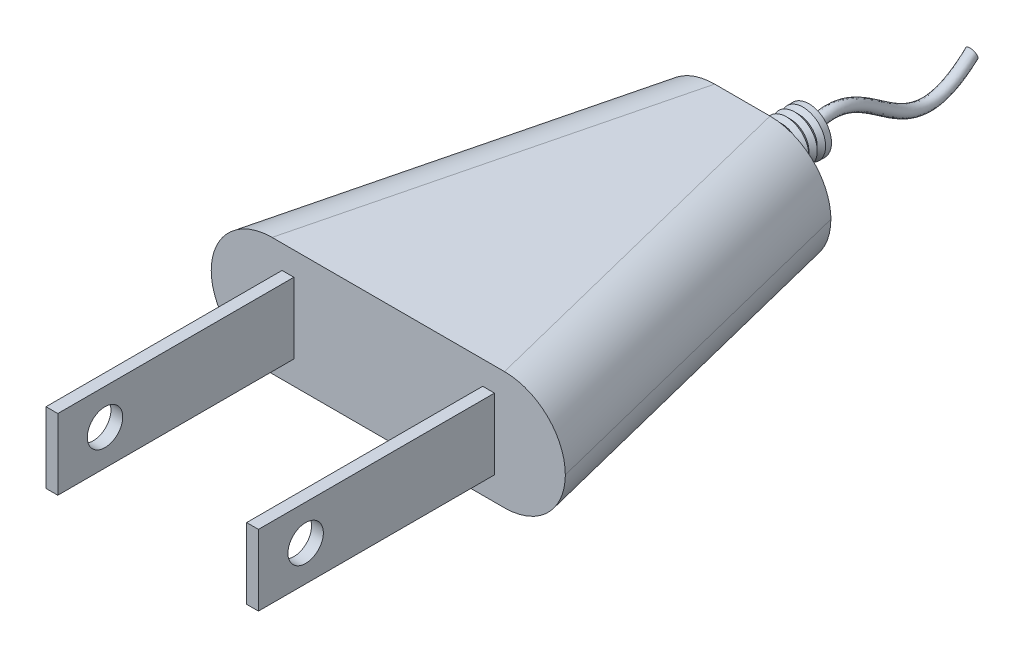
ISO-10303-21;
HEADER;
FILE_DESCRIPTION(('STEP AP214'),'2;1');
FILE_NAME('part.step','',(''),(''),'','','');
FILE_SCHEMA(('AUTOMOTIVE_DESIGN { 1 0 10303 214 1 1 1 1 }'));
ENDSEC;
DATA;
#1=APPLICATION_CONTEXT('core data for automotive mechanical design processes');
#2=APPLICATION_PROTOCOL_DEFINITION('international standard','automotive_design',2000,#1);
#3=PRODUCT_CONTEXT('',#1,'mechanical');
#4=PRODUCT('Part','Part','',(#3));
#5=PRODUCT_RELATED_PRODUCT_CATEGORY('part','',(#4));
#6=PRODUCT_DEFINITION_FORMATION('','',#4);
#7=PRODUCT_DEFINITION_CONTEXT('part definition',#1,'design');
#8=PRODUCT_DEFINITION('design','',#6,#7);
#9=PRODUCT_DEFINITION_SHAPE('','',#8);
#10=(LENGTH_UNIT() NAMED_UNIT(*) SI_UNIT(.MILLI.,.METRE.));
#11=(NAMED_UNIT(*) PLANE_ANGLE_UNIT() SI_UNIT($,.RADIAN.));
#12=(NAMED_UNIT(*) SI_UNIT($,.STERADIAN.) SOLID_ANGLE_UNIT());
#13=UNCERTAINTY_MEASURE_WITH_UNIT(LENGTH_MEASURE(1.E-05),#10,'distance_accuracy_value','');
#14=(GEOMETRIC_REPRESENTATION_CONTEXT(3) GLOBAL_UNCERTAINTY_ASSIGNED_CONTEXT((#13)) GLOBAL_UNIT_ASSIGNED_CONTEXT((#10,
#11,#12)) REPRESENTATION_CONTEXT('',''));
#15=CARTESIAN_POINT('',(0.,0.,0.));
#16=DIRECTION('',(0.,0.,1.));
#17=DIRECTION('',(1.,0.,0.));
#18=AXIS2_PLACEMENT_3D('',#15,#16,#17);
#19=CARTESIAN_POINT('',(8.99999999999999,3.,50.));
#20=DIRECTION('',(-1.,0.,0.));
#21=DIRECTION('',(0.,1.,0.));
#22=AXIS2_PLACEMENT_3D('',#19,#20,#21);
#23=PLANE('',#22);
#24=CARTESIAN_POINT('',(8.99999999999999,0.,46.));
#25=DIRECTION('',(1.,0.,0.));
#26=DIRECTION('',(0.,0.,-1.));
#27=AXIS2_PLACEMENT_3D('',#24,#25,#26);
#28=CIRCLE('',#27,1.5);
#29=CARTESIAN_POINT('',(8.99999999999999,0.,44.5));
#30=VERTEX_POINT('',#29);
#31=EDGE_CURVE('E129',#30,#30,#28,.T.);
#32=ORIENTED_EDGE('',*,*,#31,.F.);
#33=EDGE_LOOP('',(#32));
#34=FACE_BOUND('',#33,.T.);
#35=DIRECTION('',(0.,-1.,0.));
#36=VECTOR('',#35,1.);
#37=CARTESIAN_POINT('',(8.99999999999999,3.,30.));
#38=LINE('',#37,#36);
#39=CARTESIAN_POINT('',(8.99999999999999,3.,30.));
#40=VERTEX_POINT('',#39);
#41=CARTESIAN_POINT('',(8.99999999999999,-3.,30.));
#42=VERTEX_POINT('',#41);
#43=EDGE_CURVE('E126',#40,#42,#38,.T.);
#44=ORIENTED_EDGE('',*,*,#43,.F.);
#45=DIRECTION('',(0.,0.,-1.));
#46=VECTOR('',#45,1.);
#47=CARTESIAN_POINT('',(8.99999999999999,3.,50.));
#48=LINE('',#47,#46);
#49=CARTESIAN_POINT('',(8.99999999999999,3.,50.));
#50=VERTEX_POINT('',#49);
#51=EDGE_CURVE('E125',#50,#40,#48,.T.);
#52=ORIENTED_EDGE('',*,*,#51,.F.);
#53=DIRECTION('',(0.,-1.,0.));
#54=VECTOR('',#53,1.);
#55=CARTESIAN_POINT('',(8.99999999999999,3.,50.));
#56=LINE('',#55,#54);
#57=CARTESIAN_POINT('',(8.99999999999999,-3.,50.));
#58=VERTEX_POINT('',#57);
#59=EDGE_CURVE('E119',#50,#58,#56,.T.);
#60=ORIENTED_EDGE('',*,*,#59,.T.);
#61=DIRECTION('',(0.,0.,-1.));
#62=VECTOR('',#61,1.);
#63=CARTESIAN_POINT('',(8.99999999999999,-3.,50.));
#64=LINE('',#63,#62);
#65=EDGE_CURVE('E13',#58,#42,#64,.T.);
#66=ORIENTED_EDGE('',*,*,#65,.T.);
#67=EDGE_LOOP('',(#44,#52,#60,#66));
#68=FACE_BOUND('',#67,.T.);
#69=ADVANCED_FACE('F62',(#34,#68),#23,.F.);
#70=CARTESIAN_POINT('',(8.99999999999999,-3.,50.));
#71=DIRECTION('',(0.,1.,0.));
#72=DIRECTION('',(0.,0.,1.));
#73=AXIS2_PLACEMENT_3D('',#70,#71,#72);
#74=PLANE('',#73);
#75=DIRECTION('',(-1.,0.,0.));
#76=VECTOR('',#75,1.);
#77=CARTESIAN_POINT('',(8.99999999999999,-3.,30.));
#78=LINE('',#77,#76);
#79=CARTESIAN_POINT('',(7.99999999999999,-3.,30.));
#80=VERTEX_POINT('',#79);
#81=EDGE_CURVE('E128',#42,#80,#78,.T.);
#82=ORIENTED_EDGE('',*,*,#81,.F.);
#83=ORIENTED_EDGE('',*,*,#65,.F.);
#84=DIRECTION('',(-1.,0.,0.));
#85=VECTOR('',#84,1.);
#86=CARTESIAN_POINT('',(8.99999999999999,-3.,50.));
#87=LINE('',#86,#85);
#88=CARTESIAN_POINT('',(7.99999999999999,-3.,50.));
#89=VERTEX_POINT('',#88);
#90=EDGE_CURVE('E103',#58,#89,#87,.T.);
#91=ORIENTED_EDGE('',*,*,#90,.T.);
#92=DIRECTION('',(0.,0.,-1.));
#93=VECTOR('',#92,1.);
#94=CARTESIAN_POINT('',(7.99999999999999,-3.,50.));
#95=LINE('',#94,#93);
#96=EDGE_CURVE('E70',#89,#80,#95,.T.);
#97=ORIENTED_EDGE('',*,*,#96,.T.);
#98=EDGE_LOOP('',(#82,#83,#91,#97));
#99=FACE_BOUND('',#98,.T.);
#100=ADVANCED_FACE('F117',(#99),#74,.F.);
#101=CARTESIAN_POINT('',(7.99999999999999,3.,50.));
#102=DIRECTION('',(1.,0.,0.));
#103=DIRECTION('',(0.,0.,1.));
#104=AXIS2_PLACEMENT_3D('',#101,#102,#103);
#105=PLANE('',#104);
#106=CARTESIAN_POINT('',(7.99999999999999,0.,46.));
#107=DIRECTION('',(1.,0.,0.));
#108=DIRECTION('',(0.,0.,-1.));
#109=AXIS2_PLACEMENT_3D('',#106,#107,#108);
#110=CIRCLE('',#109,1.5);
#111=CARTESIAN_POINT('',(7.99999999999999,0.,44.5));
#112=VERTEX_POINT('',#111);
#113=EDGE_CURVE('E157',#112,#112,#110,.T.);
#114=ORIENTED_EDGE('',*,*,#113,.T.);
#115=EDGE_LOOP('',(#114));
#116=FACE_BOUND('',#115,.T.);
#117=DIRECTION('',(0.,1.,0.));
#118=VECTOR('',#117,1.);
#119=CARTESIAN_POINT('',(7.99999999999999,3.,30.));
#120=LINE('',#119,#118);
#121=CARTESIAN_POINT('',(7.99999999999999,3.,30.));
#122=VERTEX_POINT('',#121);
#123=EDGE_CURVE('E113',#80,#122,#120,.T.);
#124=ORIENTED_EDGE('',*,*,#123,.F.);
#125=ORIENTED_EDGE('',*,*,#96,.F.);
#126=DIRECTION('',(0.,1.,0.));
#127=VECTOR('',#126,1.);
#128=CARTESIAN_POINT('',(7.99999999999999,3.,50.));
#129=LINE('',#128,#127);
#130=CARTESIAN_POINT('',(7.99999999999999,3.,50.));
#131=VERTEX_POINT('',#130);
#132=EDGE_CURVE('E106',#89,#131,#129,.T.);
#133=ORIENTED_EDGE('',*,*,#132,.T.);
#134=DIRECTION('',(0.,0.,-1.));
#135=VECTOR('',#134,1.);
#136=CARTESIAN_POINT('',(7.99999999999999,3.,50.));
#137=LINE('',#136,#135);
#138=EDGE_CURVE('E116',#131,#122,#137,.T.);
#139=ORIENTED_EDGE('',*,*,#138,.T.);
#140=EDGE_LOOP('',(#124,#125,#133,#139));
#141=FACE_BOUND('',#140,.T.);
#142=ADVANCED_FACE('F112',(#116,#141),#105,.F.);
#143=CARTESIAN_POINT('',(8.99999999999999,3.,50.));
#144=DIRECTION('',(0.,-1.,0.));
#145=DIRECTION('',(0.,0.,-1.));
#146=AXIS2_PLACEMENT_3D('',#143,#144,#145);
#147=PLANE('',#146);
#148=DIRECTION('',(1.,0.,0.));
#149=VECTOR('',#148,1.);
#150=CARTESIAN_POINT('',(8.99999999999999,3.,30.));
#151=LINE('',#150,#149);
#152=EDGE_CURVE('E92',#122,#40,#151,.T.);
#153=ORIENTED_EDGE('',*,*,#152,.F.);
#154=ORIENTED_EDGE('',*,*,#138,.F.);
#155=DIRECTION('',(1.,0.,0.));
#156=VECTOR('',#155,1.);
#157=CARTESIAN_POINT('',(8.99999999999999,3.,50.));
#158=LINE('',#157,#156);
#159=EDGE_CURVE('E78',#131,#50,#158,.T.);
#160=ORIENTED_EDGE('',*,*,#159,.T.);
#161=ORIENTED_EDGE('',*,*,#51,.T.);
#162=EDGE_LOOP('',(#153,#154,#160,#161));
#163=FACE_BOUND('',#162,.T.);
#164=ADVANCED_FACE('F138',(#163),#147,.F.);
#165=CARTESIAN_POINT('',(0.,0.,50.));
#166=DIRECTION('',(0.,0.,1.));
#167=DIRECTION('',(-1.,0.,0.));
#168=AXIS2_PLACEMENT_3D('',#165,#166,#167);
#169=PLANE('',#168);
#170=ORIENTED_EDGE('',*,*,#59,.F.);
#171=ORIENTED_EDGE('',*,*,#159,.F.);
#172=ORIENTED_EDGE('',*,*,#132,.F.);
#173=ORIENTED_EDGE('',*,*,#90,.F.);
#174=EDGE_LOOP('',(#170,#171,#172,#173));
#175=FACE_BOUND('',#174,.T.);
#176=ADVANCED_FACE('F108',(#175),#169,.T.);
#177=CARTESIAN_POINT('',(0.,0.,30.));
#178=DIRECTION('',(0.,0.,1.));
#179=DIRECTION('',(-1.,0.,0.));
#180=AXIS2_PLACEMENT_3D('',#177,#178,#179);
#181=PLANE('',#180);
#182=ORIENTED_EDGE('',*,*,#43,.T.);
#183=ORIENTED_EDGE('',*,*,#81,.T.);
#184=ORIENTED_EDGE('',*,*,#123,.T.);
#185=ORIENTED_EDGE('',*,*,#152,.T.);
#186=EDGE_LOOP('',(#182,#183,#184,#185));
#187=FACE_BOUND('',#186,.T.);
#188=ADVANCED_FACE('F134',(#187),#181,.F.);
#189=CARTESIAN_POINT('',(8.99999999999999,0.,46.));
#190=DIRECTION('',(-1.,0.,0.));
#191=DIRECTION('',(0.,0.,-1.));
#192=AXIS2_PLACEMENT_3D('',#189,#190,#191);
#193=CYLINDRICAL_SURFACE('',#192,1.5);
#194=ORIENTED_EDGE('',*,*,#31,.T.);
#195=EDGE_LOOP('',(#194));
#196=FACE_BOUND('',#195,.T.);
#197=ORIENTED_EDGE('',*,*,#113,.F.);
#198=EDGE_LOOP('',(#197));
#199=FACE_BOUND('',#198,.T.);
#200=ADVANCED_FACE('F162',(#196,#199),#193,.F.);
#201=CLOSED_SHELL('',(#69,#100,#142,#164,#176,#188,#200));
#202=MANIFOLD_SOLID_BREP('B2',#201);
#203=CARTESIAN_POINT('',(-8.99999999999999,3.,50.));
#204=DIRECTION('',(1.,0.,0.));
#205=DIRECTION('',(0.,1.,0.));
#206=AXIS2_PLACEMENT_3D('',#203,#204,#205);
#207=PLANE('',#206);
#208=CARTESIAN_POINT('',(-8.99999999999999,0.,46.));
#209=DIRECTION('',(1.,0.,0.));
#210=DIRECTION('',(0.,0.,-1.));
#211=AXIS2_PLACEMENT_3D('',#208,#209,#210);
#212=CIRCLE('',#211,1.5);
#213=CARTESIAN_POINT('',(-8.99999999999999,0.,44.5));
#214=VERTEX_POINT('',#213);
#215=EDGE_CURVE('E288',#214,#214,#212,.T.);
#216=ORIENTED_EDGE('',*,*,#215,.T.);
#217=EDGE_LOOP('',(#216));
#218=FACE_BOUND('',#217,.T.);
#219=DIRECTION('',(0.,-1.,0.));
#220=VECTOR('',#219,1.);
#221=CARTESIAN_POINT('',(-8.99999999999999,3.,30.));
#222=LINE('',#221,#220);
#223=CARTESIAN_POINT('',(-8.99999999999999,3.,30.));
#224=VERTEX_POINT('',#223);
#225=CARTESIAN_POINT('',(-8.99999999999999,-3.,30.));
#226=VERTEX_POINT('',#225);
#227=EDGE_CURVE('E285',#224,#226,#222,.T.);
#228=ORIENTED_EDGE('',*,*,#227,.T.);
#229=DIRECTION('',(0.,0.,-1.));
#230=VECTOR('',#229,1.);
#231=CARTESIAN_POINT('',(-8.99999999999999,-3.,50.));
#232=LINE('',#231,#230);
#233=CARTESIAN_POINT('',(-8.99999999999999,-3.,50.));
#234=VERTEX_POINT('',#233);
#235=EDGE_CURVE('E60',#234,#226,#232,.T.);
#236=ORIENTED_EDGE('',*,*,#235,.F.);
#237=DIRECTION('',(0.,-1.,0.));
#238=VECTOR('',#237,1.);
#239=CARTESIAN_POINT('',(-8.99999999999999,3.,50.));
#240=LINE('',#239,#238);
#241=CARTESIAN_POINT('',(-8.99999999999999,3.,50.));
#242=VERTEX_POINT('',#241);
#243=EDGE_CURVE('E273',#242,#234,#240,.T.);
#244=ORIENTED_EDGE('',*,*,#243,.F.);
#245=DIRECTION('',(0.,0.,-1.));
#246=VECTOR('',#245,1.);
#247=CARTESIAN_POINT('',(-8.99999999999999,3.,50.));
#248=LINE('',#247,#246);
#249=EDGE_CURVE('E281',#242,#224,#248,.T.);
#250=ORIENTED_EDGE('',*,*,#249,.T.);
#251=EDGE_LOOP('',(#228,#236,#244,#250));
#252=FACE_BOUND('',#251,.T.);
#253=ADVANCED_FACE('F222',(#218,#252),#207,.F.);
#254=CARTESIAN_POINT('',(-8.99999999999999,-3.,50.));
#255=DIRECTION('',(0.,1.,0.));
#256=DIRECTION('',(0.,0.,1.));
#257=AXIS2_PLACEMENT_3D('',#254,#255,#256);
#258=PLANE('',#257);
#259=DIRECTION('',(1.,0.,0.));
#260=VECTOR('',#259,1.);
#261=CARTESIAN_POINT('',(-8.99999999999999,-3.,30.));
#262=LINE('',#261,#260);
#263=CARTESIAN_POINT('',(-7.99999999999999,-3.,30.));
#264=VERTEX_POINT('',#263);
#265=EDGE_CURVE('E277',#226,#264,#262,.T.);
#266=ORIENTED_EDGE('',*,*,#265,.T.);
#267=DIRECTION('',(0.,0.,-1.));
#268=VECTOR('',#267,1.);
#269=CARTESIAN_POINT('',(-7.99999999999999,-3.,50.));
#270=LINE('',#269,#268);
#271=CARTESIAN_POINT('',(-7.99999999999999,-3.,50.));
#272=VERTEX_POINT('',#271);
#273=EDGE_CURVE('E230',#272,#264,#270,.T.);
#274=ORIENTED_EDGE('',*,*,#273,.F.);
#275=DIRECTION('',(1.,0.,0.));
#276=VECTOR('',#275,1.);
#277=CARTESIAN_POINT('',(-8.99999999999999,-3.,50.));
#278=LINE('',#277,#276);
#279=EDGE_CURVE('E268',#234,#272,#278,.T.);
#280=ORIENTED_EDGE('',*,*,#279,.F.);
#281=ORIENTED_EDGE('',*,*,#235,.T.);
#282=EDGE_LOOP('',(#266,#274,#280,#281));
#283=FACE_BOUND('',#282,.T.);
#284=ADVANCED_FACE('F276',(#283),#258,.F.);
#285=CARTESIAN_POINT('',(-7.99999999999999,3.,50.));
#286=DIRECTION('',(-1.,0.,0.));
#287=DIRECTION('',(0.,0.,1.));
#288=AXIS2_PLACEMENT_3D('',#285,#286,#287);
#289=PLANE('',#288);
#290=CARTESIAN_POINT('',(-7.99999999999999,0.,46.));
#291=DIRECTION('',(1.,0.,0.));
#292=DIRECTION('',(0.,0.,-1.));
#293=AXIS2_PLACEMENT_3D('',#290,#291,#292);
#294=CIRCLE('',#293,1.5);
#295=CARTESIAN_POINT('',(-7.99999999999999,0.,44.5));
#296=VERTEX_POINT('',#295);
#297=EDGE_CURVE('E299',#296,#296,#294,.T.);
#298=ORIENTED_EDGE('',*,*,#297,.F.);
#299=EDGE_LOOP('',(#298));
#300=FACE_BOUND('',#299,.T.);
#301=DIRECTION('',(0.,1.,0.));
#302=VECTOR('',#301,1.);
#303=CARTESIAN_POINT('',(-7.99999999999999,3.,30.));
#304=LINE('',#303,#302);
#305=CARTESIAN_POINT('',(-7.99999999999999,3.,30.));
#306=VERTEX_POINT('',#305);
#307=EDGE_CURVE('E255',#264,#306,#304,.T.);
#308=ORIENTED_EDGE('',*,*,#307,.T.);
#309=DIRECTION('',(0.,0.,-1.));
#310=VECTOR('',#309,1.);
#311=CARTESIAN_POINT('',(-7.99999999999999,3.,50.));
#312=LINE('',#311,#310);
#313=CARTESIAN_POINT('',(-7.99999999999999,3.,50.));
#314=VERTEX_POINT('',#313);
#315=EDGE_CURVE('E278',#314,#306,#312,.T.);
#316=ORIENTED_EDGE('',*,*,#315,.F.);
#317=DIRECTION('',(0.,1.,0.));
#318=VECTOR('',#317,1.);
#319=CARTESIAN_POINT('',(-7.99999999999999,3.,50.));
#320=LINE('',#319,#318);
#321=EDGE_CURVE('E271',#272,#314,#320,.T.);
#322=ORIENTED_EDGE('',*,*,#321,.F.);
#323=ORIENTED_EDGE('',*,*,#273,.T.);
#324=EDGE_LOOP('',(#308,#316,#322,#323));
#325=FACE_BOUND('',#324,.T.);
#326=ADVANCED_FACE('F279',(#300,#325),#289,.F.);
#327=CARTESIAN_POINT('',(-8.99999999999999,3.,50.));
#328=DIRECTION('',(0.,-1.,0.));
#329=DIRECTION('',(0.,0.,-1.));
#330=AXIS2_PLACEMENT_3D('',#327,#328,#329);
#331=PLANE('',#330);
#332=DIRECTION('',(-1.,0.,0.));
#333=VECTOR('',#332,1.);
#334=CARTESIAN_POINT('',(-8.99999999999999,3.,30.));
#335=LINE('',#334,#333);
#336=EDGE_CURVE('E261',#306,#224,#335,.T.);
#337=ORIENTED_EDGE('',*,*,#336,.T.);
#338=ORIENTED_EDGE('',*,*,#249,.F.);
#339=DIRECTION('',(-1.,0.,0.));
#340=VECTOR('',#339,1.);
#341=CARTESIAN_POINT('',(-8.99999999999999,3.,50.));
#342=LINE('',#341,#340);
#343=EDGE_CURVE('E238',#314,#242,#342,.T.);
#344=ORIENTED_EDGE('',*,*,#343,.F.);
#345=ORIENTED_EDGE('',*,*,#315,.T.);
#346=EDGE_LOOP('',(#337,#338,#344,#345));
#347=FACE_BOUND('',#346,.T.);
#348=ADVANCED_FACE('F293',(#347),#331,.F.);
#349=CARTESIAN_POINT('',(0.,0.,50.));
#350=DIRECTION('',(0.,0.,1.));
#351=DIRECTION('',(1.,0.,0.));
#352=AXIS2_PLACEMENT_3D('',#349,#350,#351);
#353=PLANE('',#352);
#354=ORIENTED_EDGE('',*,*,#243,.T.);
#355=ORIENTED_EDGE('',*,*,#279,.T.);
#356=ORIENTED_EDGE('',*,*,#321,.T.);
#357=ORIENTED_EDGE('',*,*,#343,.T.);
#358=EDGE_LOOP('',(#354,#355,#356,#357));
#359=FACE_BOUND('',#358,.T.);
#360=ADVANCED_FACE('F269',(#359),#353,.T.);
#361=CARTESIAN_POINT('',(0.,0.,30.));
#362=DIRECTION('',(0.,0.,1.));
#363=DIRECTION('',(1.,0.,0.));
#364=AXIS2_PLACEMENT_3D('',#361,#362,#363);
#365=PLANE('',#364);
#366=ORIENTED_EDGE('',*,*,#227,.F.);
#367=ORIENTED_EDGE('',*,*,#336,.F.);
#368=ORIENTED_EDGE('',*,*,#307,.F.);
#369=ORIENTED_EDGE('',*,*,#265,.F.);
#370=EDGE_LOOP('',(#366,#367,#368,#369));
#371=FACE_BOUND('',#370,.T.);
#372=ADVANCED_FACE('F296',(#371),#365,.F.);
#373=CARTESIAN_POINT('',(-8.99999999999999,0.,46.));
#374=DIRECTION('',(1.,0.,0.));
#375=DIRECTION('',(0.,0.,-1.));
#376=AXIS2_PLACEMENT_3D('',#373,#374,#375);
#377=CYLINDRICAL_SURFACE('',#376,1.5);
#378=ORIENTED_EDGE('',*,*,#215,.F.);
#379=EDGE_LOOP('',(#378));
#380=FACE_BOUND('',#379,.T.);
#381=ORIENTED_EDGE('',*,*,#297,.T.);
#382=EDGE_LOOP('',(#381));
#383=FACE_BOUND('',#382,.T.);
#384=ADVANCED_FACE('F306',(#380,#383),#377,.F.);
#385=CLOSED_SHELL('',(#253,#284,#326,#348,#360,#372,#384));
#386=MANIFOLD_SOLID_BREP('B7',#385);
#387=CARTESIAN_POINT('',(0.,0.,0.));
#388=DIRECTION('',(0.,0.,-1.));
#389=DIRECTION('',(-1.,0.,0.));
#390=AXIS2_PLACEMENT_3D('',#387,#388,#389);
#391=PLANE('',#390);
#392=CARTESIAN_POINT('',(0.,0.,0.));
#393=DIRECTION('',(0.,0.,-1.));
#394=DIRECTION('',(-1.,0.,0.));
#395=AXIS2_PLACEMENT_3D('',#392,#393,#394);
#396=CIRCLE('',#395,1.91091198603265);
#397=CARTESIAN_POINT('',(-1.91091198603265,0.,0.));
#398=VERTEX_POINT('',#397);
#399=EDGE_CURVE('E381',#398,#398,#396,.T.);
#400=ORIENTED_EDGE('',*,*,#399,.F.);
#401=EDGE_LOOP('',(#400));
#402=FACE_BOUND('',#401,.T.);
#403=DIRECTION('',(1.,0.,0.));
#404=VECTOR('',#403,1.);
#405=CARTESIAN_POINT('',(-7.49999999999999,-4.99999999999999,0.));
#406=LINE('',#405,#404);
#407=CARTESIAN_POINT('',(-2.34611796797791,-4.99999999999999,0.));
#408=VERTEX_POINT('',#407);
#409=CARTESIAN_POINT('',(2.34611796797793,-4.99999999999999,0.));
#410=VERTEX_POINT('',#409);
#411=EDGE_CURVE('E554',#408,#410,#406,.T.);
#412=ORIENTED_EDGE('',*,*,#411,.F.);
#413=CARTESIAN_POINT('',(-2.34611796797791,0.,0.));
#414=DIRECTION('',(0.,0.,-1.));
#415=DIRECTION('',(1.,0.,0.));
#416=AXIS2_PLACEMENT_3D('',#413,#414,#415);
#417=ELLIPSE('',#416,5.15388203202208,5.);
#418=CARTESIAN_POINT('',(-7.49999999999999,0.,0.));
#419=VERTEX_POINT('',#418);
#420=EDGE_CURVE('E601',#408,#419,#417,.T.);
#421=ORIENTED_EDGE('',*,*,#420,.T.);
#422=CARTESIAN_POINT('',(-2.34611796797791,0.,0.));
#423=DIRECTION('',(0.,0.,-1.));
#424=DIRECTION('',(1.,0.,0.));
#425=AXIS2_PLACEMENT_3D('',#422,#423,#424);
#426=ELLIPSE('',#425,5.15388203202208,5.);
#427=CARTESIAN_POINT('',(-2.34611796797791,5.,0.));
#428=VERTEX_POINT('',#427);
#429=EDGE_CURVE('E608',#419,#428,#426,.T.);
#430=ORIENTED_EDGE('',*,*,#429,.T.);
#431=DIRECTION('',(-1.,0.,0.));
#432=VECTOR('',#431,1.);
#433=CARTESIAN_POINT('',(-7.49999999999999,5.,0.));
#434=LINE('',#433,#432);
#435=CARTESIAN_POINT('',(2.34611796797793,5.,0.));
#436=VERTEX_POINT('',#435);
#437=EDGE_CURVE('E513',#436,#428,#434,.T.);
#438=ORIENTED_EDGE('',*,*,#437,.F.);
#439=CARTESIAN_POINT('',(2.34611796797793,0.,0.));
#440=DIRECTION('',(0.,0.,-1.));
#441=DIRECTION('',(-1.,0.,0.));
#442=AXIS2_PLACEMENT_3D('',#439,#440,#441);
#443=ELLIPSE('',#442,5.15388203202208,5.);
#444=CARTESIAN_POINT('',(7.50000000000001,0.,0.));
#445=VERTEX_POINT('',#444);
#446=EDGE_CURVE('E520',#436,#445,#443,.T.);
#447=ORIENTED_EDGE('',*,*,#446,.T.);
#448=CARTESIAN_POINT('',(2.34611796797793,0.,0.));
#449=DIRECTION('',(0.,0.,-1.));
#450=DIRECTION('',(-1.,0.,0.));
#451=AXIS2_PLACEMENT_3D('',#448,#449,#450);
#452=ELLIPSE('',#451,5.15388203202208,5.);
#453=EDGE_CURVE('E609',#445,#410,#452,.T.);
#454=ORIENTED_EDGE('',*,*,#453,.T.);
#455=EDGE_LOOP('',(#412,#421,#430,#438,#447,#454));
#456=FACE_BOUND('',#455,.T.);
#457=ADVANCED_FACE('F373',(#402,#456),#391,.T.);
#458=CARTESIAN_POINT('',(0.,0.,30.));
#459=DIRECTION('',(0.,0.,1.));
#460=DIRECTION('',(1.,0.,0.));
#461=AXIS2_PLACEMENT_3D('',#458,#459,#460);
#462=PLANE('',#461);
#463=CARTESIAN_POINT('',(-9.84611796797791,0.,30.));
#464=DIRECTION('',(0.,0.,1.));
#465=DIRECTION('',(1.,0.,0.));
#466=AXIS2_PLACEMENT_3D('',#463,#464,#465);
#467=ELLIPSE('',#466,5.15388203202208,5.);
#468=CARTESIAN_POINT('',(-9.84611796797791,5.,30.));
#469=VERTEX_POINT('',#468);
#470=CARTESIAN_POINT('',(-15.,0.,30.));
#471=VERTEX_POINT('',#470);
#472=EDGE_CURVE('E607',#469,#471,#467,.T.);
#473=ORIENTED_EDGE('',*,*,#472,.T.);
#474=CARTESIAN_POINT('',(-9.84611796797791,0.,30.));
#475=DIRECTION('',(0.,0.,1.));
#476=DIRECTION('',(1.,0.,0.));
#477=AXIS2_PLACEMENT_3D('',#474,#475,#476);
#478=ELLIPSE('',#477,5.15388203202208,5.);
#479=CARTESIAN_POINT('',(-9.84611796797791,-5.,30.));
#480=VERTEX_POINT('',#479);
#481=EDGE_CURVE('E590',#471,#480,#478,.T.);
#482=ORIENTED_EDGE('',*,*,#481,.T.);
#483=DIRECTION('',(1.,0.,0.));
#484=VECTOR('',#483,1.);
#485=CARTESIAN_POINT('',(-15.,-5.,30.));
#486=LINE('',#485,#484);
#487=CARTESIAN_POINT('',(9.84611796797793,-5.,30.));
#488=VERTEX_POINT('',#487);
#489=EDGE_CURVE('E558',#480,#488,#486,.T.);
#490=ORIENTED_EDGE('',*,*,#489,.T.);
#491=CARTESIAN_POINT('',(9.84611796797793,0.,30.));
#492=DIRECTION('',(0.,0.,1.));
#493=DIRECTION('',(-1.,0.,0.));
#494=AXIS2_PLACEMENT_3D('',#491,#492,#493);
#495=ELLIPSE('',#494,5.15388203202208,5.);
#496=CARTESIAN_POINT('',(15.,0.,30.));
#497=VERTEX_POINT('',#496);
#498=EDGE_CURVE('E623',#488,#497,#495,.T.);
#499=ORIENTED_EDGE('',*,*,#498,.T.);
#500=CARTESIAN_POINT('',(9.84611796797793,0.,30.));
#501=DIRECTION('',(0.,0.,1.));
#502=DIRECTION('',(-1.,0.,0.));
#503=AXIS2_PLACEMENT_3D('',#500,#501,#502);
#504=ELLIPSE('',#503,5.15388203202208,5.);
#505=CARTESIAN_POINT('',(9.84611796797793,5.,30.));
#506=VERTEX_POINT('',#505);
#507=EDGE_CURVE('E395',#497,#506,#504,.T.);
#508=ORIENTED_EDGE('',*,*,#507,.T.);
#509=DIRECTION('',(-1.,0.,0.));
#510=VECTOR('',#509,1.);
#511=CARTESIAN_POINT('',(-15.,5.,30.));
#512=LINE('',#511,#510);
#513=EDGE_CURVE('E574',#506,#469,#512,.T.);
#514=ORIENTED_EDGE('',*,*,#513,.T.);
#515=EDGE_LOOP('',(#473,#482,#490,#499,#508,#514));
#516=FACE_BOUND('',#515,.T.);
#517=ADVANCED_FACE('F490',(#516),#462,.T.);
#518=CARTESIAN_POINT('',(0.,5.,0.));
#519=DIRECTION('',(0.,1.,0.));
#520=DIRECTION('',(0.,0.,1.));
#521=AXIS2_PLACEMENT_3D('',#518,#519,#520);
#522=PLANE('',#521);
#523=ORIENTED_EDGE('',*,*,#437,.T.);
#524=DIRECTION('',(0.242535625036333,0.,-0.970142500145332));
#525=VECTOR('',#524,1.);
#526=CARTESIAN_POINT('',(-2.2081110286851,5.,-0.552027757171273));
#527=LINE('',#526,#525);
#528=EDGE_CURVE('E388',#428,#469,#527,.F.);
#529=ORIENTED_EDGE('',*,*,#528,.T.);
#530=ORIENTED_EDGE('',*,*,#513,.F.);
#531=DIRECTION('',(-0.242535625036333,0.,-0.970142500145332));
#532=VECTOR('',#531,1.);
#533=CARTESIAN_POINT('',(2.20811102868511,5.,-0.552027757171277));
#534=LINE('',#533,#532);
#535=EDGE_CURVE('E588',#506,#436,#534,.T.);
#536=ORIENTED_EDGE('',*,*,#535,.T.);
#537=EDGE_LOOP('',(#523,#529,#530,#536));
#538=FACE_BOUND('',#537,.T.);
#539=ADVANCED_FACE('F480',(#538),#522,.T.);
#540=CARTESIAN_POINT('',(0.,-4.99999999999999,0.));
#541=DIRECTION('',(0.,-1.,0.));
#542=DIRECTION('',(0.,0.,-1.));
#543=AXIS2_PLACEMENT_3D('',#540,#541,#542);
#544=PLANE('',#543);
#545=ORIENTED_EDGE('',*,*,#489,.F.);
#546=DIRECTION('',(0.242535625036333,0.,-0.970142500145332));
#547=VECTOR('',#546,1.);
#548=CARTESIAN_POINT('',(-2.20811102868509,-4.99999999999999,-0.552027757171275));
#549=LINE('',#548,#547);
#550=EDGE_CURVE('E636',#480,#408,#549,.T.);
#551=ORIENTED_EDGE('',*,*,#550,.T.);
#552=ORIENTED_EDGE('',*,*,#411,.T.);
#553=DIRECTION('',(-0.242535625036333,0.,-0.970142500145332));
#554=VECTOR('',#553,1.);
#555=CARTESIAN_POINT('',(2.20811102868511,-4.99999999999999,-0.55202775717128));
#556=LINE('',#555,#554);
#557=EDGE_CURVE('E584',#410,#488,#556,.F.);
#558=ORIENTED_EDGE('',*,*,#557,.T.);
#559=EDGE_LOOP('',(#545,#551,#552,#558));
#560=FACE_BOUND('',#559,.T.);
#561=ADVANCED_FACE('F489',(#560),#544,.T.);
#562=CARTESIAN_POINT('',(-2.20811102868509,0.,-0.552027757171274));
#563=DIRECTION('',(0.242535625036333,0.,-0.970142500145332));
#564=DIRECTION('',(-0.970142500145332,0.,-0.242535625036333));
#565=AXIS2_PLACEMENT_3D('',#562,#563,#564);
#566=CYLINDRICAL_SURFACE('',#565,5.);
#567=DIRECTION('',(0.242535625036333,0.,-0.970142500145332));
#568=VECTOR('',#567,1.);
#569=CARTESIAN_POINT('',(-7.05882352941176,0.,-1.76470588235294));
#570=LINE('',#569,#568);
#571=EDGE_CURVE('E575',#471,#419,#570,.T.);
#572=ORIENTED_EDGE('',*,*,#571,.F.);
#573=ORIENTED_EDGE('',*,*,#472,.F.);
#574=ORIENTED_EDGE('',*,*,#528,.F.);
#575=ORIENTED_EDGE('',*,*,#429,.F.);
#576=EDGE_LOOP('',(#572,#573,#574,#575));
#577=FACE_BOUND('',#576,.T.);
#578=ADVANCED_FACE('F606',(#577),#566,.T.);
#579=CARTESIAN_POINT('',(-2.20811102868509,0.,-0.552027757171274));
#580=DIRECTION('',(0.242535625036333,0.,-0.970142500145332));
#581=DIRECTION('',(-0.970142500145332,0.,-0.242535625036333));
#582=AXIS2_PLACEMENT_3D('',#579,#580,#581);
#583=CYLINDRICAL_SURFACE('',#582,5.);
#584=ORIENTED_EDGE('',*,*,#481,.F.);
#585=ORIENTED_EDGE('',*,*,#571,.T.);
#586=ORIENTED_EDGE('',*,*,#420,.F.);
#587=ORIENTED_EDGE('',*,*,#550,.F.);
#588=EDGE_LOOP('',(#584,#585,#586,#587));
#589=FACE_BOUND('',#588,.T.);
#590=ADVANCED_FACE('F539',(#589),#583,.T.);
#591=CARTESIAN_POINT('',(2.20811102868511,0.,-0.552027757171278));
#592=DIRECTION('',(-0.242535625036333,0.,-0.970142500145332));
#593=DIRECTION('',(-0.970142500145332,0.,0.242535625036333));
#594=AXIS2_PLACEMENT_3D('',#591,#592,#593);
#595=CYLINDRICAL_SURFACE('',#594,5.);
#596=ORIENTED_EDGE('',*,*,#535,.F.);
#597=ORIENTED_EDGE('',*,*,#507,.F.);
#598=DIRECTION('',(-0.242535625036333,0.,-0.970142500145332));
#599=VECTOR('',#598,1.);
#600=CARTESIAN_POINT('',(7.05882352941177,0.,-1.76470588235294));
#601=LINE('',#600,#599);
#602=EDGE_CURVE('E470',#445,#497,#601,.F.);
#603=ORIENTED_EDGE('',*,*,#602,.F.);
#604=ORIENTED_EDGE('',*,*,#446,.F.);
#605=EDGE_LOOP('',(#596,#597,#603,#604));
#606=FACE_BOUND('',#605,.T.);
#607=ADVANCED_FACE('F375',(#606),#595,.T.);
#608=CARTESIAN_POINT('',(2.20811102868511,0.,-0.552027757171278));
#609=DIRECTION('',(-0.242535625036333,0.,-0.970142500145332));
#610=DIRECTION('',(-0.970142500145332,0.,0.242535625036333));
#611=AXIS2_PLACEMENT_3D('',#608,#609,#610);
#612=CYLINDRICAL_SURFACE('',#611,5.);
#613=ORIENTED_EDGE('',*,*,#498,.F.);
#614=ORIENTED_EDGE('',*,*,#557,.F.);
#615=ORIENTED_EDGE('',*,*,#453,.F.);
#616=ORIENTED_EDGE('',*,*,#602,.T.);
#617=EDGE_LOOP('',(#613,#614,#615,#616));
#618=FACE_BOUND('',#617,.T.);
#619=ADVANCED_FACE('F644',(#618),#612,.T.);
#620=CARTESIAN_POINT('',(0.,0.,-5.64309625727099));
#621=DIRECTION('',(0.,0.,-1.));
#622=DIRECTION('',(0.,1.,0.));
#623=AXIS2_PLACEMENT_3D('',#620,#621,#622);
#624=CYLINDRICAL_SURFACE('',#623,1.91091198603265);
#625=ORIENTED_EDGE('',*,*,#399,.T.);
#626=EDGE_LOOP('',(#625));
#627=FACE_BOUND('',#626,.T.);
#628=CARTESIAN_POINT('',(0.,0.,-1.60756235133825));
#629=DIRECTION('',(0.,0.,-1.));
#630=DIRECTION('',(0.,1.,0.));
#631=AXIS2_PLACEMENT_3D('',#628,#629,#630);
#632=CIRCLE('',#631,1.91091198603265);
#633=CARTESIAN_POINT('',(0.,1.91091198603265,-1.60756235133825));
#634=VERTEX_POINT('',#633);
#635=EDGE_CURVE('E467',#634,#634,#632,.T.);
#636=ORIENTED_EDGE('',*,*,#635,.F.);
#637=EDGE_LOOP('',(#636));
#638=FACE_BOUND('',#637,.T.);
#639=ADVANCED_FACE('F646',(#627,#638),#624,.T.);
#640=CARTESIAN_POINT('',(0.,0.,-1.96111574193152));
#641=DIRECTION('',(0.,0.,1.));
#642=DIRECTION('',(0.,-1.,0.));
#643=AXIS2_PLACEMENT_3D('',#640,#641,#642);
#644=CONICAL_SURFACE('',#643,1.55735859543938,0.785398163397448);
#645=ORIENTED_EDGE('',*,*,#635,.T.);
#646=EDGE_LOOP('',(#645));
#647=FACE_BOUND('',#646,.T.);
#648=CARTESIAN_POINT('',(0.,0.,-1.96111574193152));
#649=DIRECTION('',(0.,0.,-1.));
#650=DIRECTION('',(0.,1.,0.));
#651=AXIS2_PLACEMENT_3D('',#648,#649,#650);
#652=CIRCLE('',#651,1.55735859543938);
#653=CARTESIAN_POINT('',(0.,1.55735859543938,-1.96111574193152));
#654=VERTEX_POINT('',#653);
#655=EDGE_CURVE('E464',#654,#654,#652,.T.);
#656=ORIENTED_EDGE('',*,*,#655,.F.);
#657=EDGE_LOOP('',(#656));
#658=FACE_BOUND('',#657,.T.);
#659=ADVANCED_FACE('F651',(#647,#658),#644,.T.);
#660=CARTESIAN_POINT('',(0.,0.,-2.3146691325248));
#661=DIRECTION('',(0.,0.,-1.));
#662=DIRECTION('',(0.,1.,0.));
#663=AXIS2_PLACEMENT_3D('',#660,#661,#662);
#664=CONICAL_SURFACE('',#663,1.91091198603265,0.785398163397447);
#665=ORIENTED_EDGE('',*,*,#655,.T.);
#666=EDGE_LOOP('',(#665));
#667=FACE_BOUND('',#666,.T.);
#668=CARTESIAN_POINT('',(0.,0.,-2.3146691325248));
#669=DIRECTION('',(0.,0.,-1.));
#670=DIRECTION('',(0.,1.,0.));
#671=AXIS2_PLACEMENT_3D('',#668,#669,#670);
#672=CIRCLE('',#671,1.91091198603265);
#673=CARTESIAN_POINT('',(0.,1.91091198603265,-2.3146691325248));
#674=VERTEX_POINT('',#673);
#675=EDGE_CURVE('E461',#674,#674,#672,.T.);
#676=ORIENTED_EDGE('',*,*,#675,.F.);
#677=EDGE_LOOP('',(#676));
#678=FACE_BOUND('',#677,.T.);
#679=ADVANCED_FACE('F691',(#667,#678),#664,.T.);
#680=CARTESIAN_POINT('',(0.,0.,-2.66822252311807));
#681=DIRECTION('',(0.,0.,1.));
#682=DIRECTION('',(0.,-1.,0.));
#683=AXIS2_PLACEMENT_3D('',#680,#681,#682);
#684=CONICAL_SURFACE('',#683,1.55735859543938,0.785398163397447);
#685=ORIENTED_EDGE('',*,*,#675,.T.);
#686=EDGE_LOOP('',(#685));
#687=FACE_BOUND('',#686,.T.);
#688=CARTESIAN_POINT('',(0.,0.,-2.66822252311807));
#689=DIRECTION('',(0.,0.,-1.));
#690=DIRECTION('',(0.,1.,0.));
#691=AXIS2_PLACEMENT_3D('',#688,#689,#690);
#692=CIRCLE('',#691,1.55735859543938);
#693=CARTESIAN_POINT('',(0.,1.55735859543938,-2.66822252311807));
#694=VERTEX_POINT('',#693);
#695=EDGE_CURVE('E458',#694,#694,#692,.T.);
#696=ORIENTED_EDGE('',*,*,#695,.F.);
#697=EDGE_LOOP('',(#696));
#698=FACE_BOUND('',#697,.T.);
#699=ADVANCED_FACE('F701',(#687,#698),#684,.T.);
#700=CARTESIAN_POINT('',(0.,0.,-3.02177591371135));
#701=DIRECTION('',(0.,0.,-1.));
#702=DIRECTION('',(0.,1.,0.));
#703=AXIS2_PLACEMENT_3D('',#700,#701,#702);
#704=CONICAL_SURFACE('',#703,1.91091198603265,0.78539816339745);
#705=ORIENTED_EDGE('',*,*,#695,.T.);
#706=EDGE_LOOP('',(#705));
#707=FACE_BOUND('',#706,.T.);
#708=CARTESIAN_POINT('',(0.,0.,-3.02177591371135));
#709=DIRECTION('',(0.,0.,-1.));
#710=DIRECTION('',(0.,1.,0.));
#711=AXIS2_PLACEMENT_3D('',#708,#709,#710);
#712=CIRCLE('',#711,1.91091198603265);
#713=CARTESIAN_POINT('',(0.,1.91091198603265,-3.02177591371135));
#714=VERTEX_POINT('',#713);
#715=EDGE_CURVE('E455',#714,#714,#712,.T.);
#716=ORIENTED_EDGE('',*,*,#715,.F.);
#717=EDGE_LOOP('',(#716));
#718=FACE_BOUND('',#717,.T.);
#719=ADVANCED_FACE('F711',(#707,#718),#704,.T.);
#720=CARTESIAN_POINT('',(0.,0.,-3.37532930430462));
#721=DIRECTION('',(0.,0.,1.));
#722=DIRECTION('',(0.,-1.,0.));
#723=AXIS2_PLACEMENT_3D('',#720,#721,#722);
#724=CONICAL_SURFACE('',#723,1.55735859543938,0.785398163397448);
#725=ORIENTED_EDGE('',*,*,#715,.T.);
#726=EDGE_LOOP('',(#725));
#727=FACE_BOUND('',#726,.T.);
#728=CARTESIAN_POINT('',(0.,0.,-3.37532930430462));
#729=DIRECTION('',(0.,0.,-1.));
#730=DIRECTION('',(0.,1.,0.));
#731=AXIS2_PLACEMENT_3D('',#728,#729,#730);
#732=CIRCLE('',#731,1.55735859543938);
#733=CARTESIAN_POINT('',(0.,1.55735859543938,-3.37532930430462));
#734=VERTEX_POINT('',#733);
#735=EDGE_CURVE('E452',#734,#734,#732,.T.);
#736=ORIENTED_EDGE('',*,*,#735,.F.);
#737=EDGE_LOOP('',(#736));
#738=FACE_BOUND('',#737,.T.);
#739=ADVANCED_FACE('F721',(#727,#738),#724,.T.);
#740=CARTESIAN_POINT('',(0.,0.,-3.72888269489789));
#741=DIRECTION('',(0.,0.,-1.));
#742=DIRECTION('',(0.,1.,0.));
#743=AXIS2_PLACEMENT_3D('',#740,#741,#742);
#744=CONICAL_SURFACE('',#743,1.91091198603265,0.785398163397448);
#745=ORIENTED_EDGE('',*,*,#735,.T.);
#746=EDGE_LOOP('',(#745));
#747=FACE_BOUND('',#746,.T.);
#748=CARTESIAN_POINT('',(0.,0.,-3.72888269489789));
#749=DIRECTION('',(0.,0.,-1.));
#750=DIRECTION('',(0.,1.,0.));
#751=AXIS2_PLACEMENT_3D('',#748,#749,#750);
#752=CIRCLE('',#751,1.91091198603265);
#753=CARTESIAN_POINT('',(0.,1.91091198603265,-3.72888269489789));
#754=VERTEX_POINT('',#753);
#755=EDGE_CURVE('E449',#754,#754,#752,.T.);
#756=ORIENTED_EDGE('',*,*,#755,.F.);
#757=EDGE_LOOP('',(#756));
#758=FACE_BOUND('',#757,.T.);
#759=ADVANCED_FACE('F731',(#747,#758),#744,.T.);
#760=CARTESIAN_POINT('',(0.,0.,-4.08243608549117));
#761=DIRECTION('',(0.,0.,1.));
#762=DIRECTION('',(0.,-1.,0.));
#763=AXIS2_PLACEMENT_3D('',#760,#761,#762);
#764=CONICAL_SURFACE('',#763,1.55735859543938,0.785398163397449);
#765=ORIENTED_EDGE('',*,*,#755,.T.);
#766=EDGE_LOOP('',(#765));
#767=FACE_BOUND('',#766,.T.);
#768=CARTESIAN_POINT('',(0.,0.,-4.08243608549117));
#769=DIRECTION('',(0.,0.,-1.));
#770=DIRECTION('',(0.,1.,0.));
#771=AXIS2_PLACEMENT_3D('',#768,#769,#770);
#772=CIRCLE('',#771,1.55735859543938);
#773=CARTESIAN_POINT('',(0.,1.55735859543938,-4.08243608549117));
#774=VERTEX_POINT('',#773);
#775=EDGE_CURVE('E446',#774,#774,#772,.T.);
#776=ORIENTED_EDGE('',*,*,#775,.F.);
#777=EDGE_LOOP('',(#776));
#778=FACE_BOUND('',#777,.T.);
#779=ADVANCED_FACE('F741',(#767,#778),#764,.T.);
#780=CARTESIAN_POINT('',(0.,0.,-4.43598947608444));
#781=DIRECTION('',(0.,0.,-1.));
#782=DIRECTION('',(0.,1.,0.));
#783=AXIS2_PLACEMENT_3D('',#780,#781,#782);
#784=CONICAL_SURFACE('',#783,1.91091198603265,0.785398163397452);
#785=ORIENTED_EDGE('',*,*,#775,.T.);
#786=EDGE_LOOP('',(#785));
#787=FACE_BOUND('',#786,.T.);
#788=CARTESIAN_POINT('',(0.,0.,-4.43598947608444));
#789=DIRECTION('',(0.,0.,-1.));
#790=DIRECTION('',(0.,1.,0.));
#791=AXIS2_PLACEMENT_3D('',#788,#789,#790);
#792=CIRCLE('',#791,1.91091198603265);
#793=CARTESIAN_POINT('',(0.,1.91091198603265,-4.43598947608444));
#794=VERTEX_POINT('',#793);
#795=EDGE_CURVE('E443',#794,#794,#792,.T.);
#796=ORIENTED_EDGE('',*,*,#795,.F.);
#797=EDGE_LOOP('',(#796));
#798=FACE_BOUND('',#797,.T.);
#799=ADVANCED_FACE('F751',(#787,#798),#784,.T.);
#800=CARTESIAN_POINT('',(0.,0.,-4.78954286667771));
#801=DIRECTION('',(0.,0.,1.));
#802=DIRECTION('',(0.,-1.,0.));
#803=AXIS2_PLACEMENT_3D('',#800,#801,#802);
#804=CONICAL_SURFACE('',#803,1.55735859543938,0.785398163397446);
#805=ORIENTED_EDGE('',*,*,#795,.T.);
#806=EDGE_LOOP('',(#805));
#807=FACE_BOUND('',#806,.T.);
#808=CARTESIAN_POINT('',(0.,0.,-4.78954286667771));
#809=DIRECTION('',(0.,0.,-1.));
#810=DIRECTION('',(0.,1.,0.));
#811=AXIS2_PLACEMENT_3D('',#808,#809,#810);
#812=CIRCLE('',#811,1.55735859543938);
#813=CARTESIAN_POINT('',(0.,1.55735859543938,-4.78954286667771));
#814=VERTEX_POINT('',#813);
#815=EDGE_CURVE('E440',#814,#814,#812,.T.);
#816=ORIENTED_EDGE('',*,*,#815,.F.);
#817=EDGE_LOOP('',(#816));
#818=FACE_BOUND('',#817,.T.);
#819=ADVANCED_FACE('F761',(#807,#818),#804,.T.);
#820=CARTESIAN_POINT('',(0.,0.,-5.14309625727099));
#821=DIRECTION('',(0.,0.,-1.));
#822=DIRECTION('',(0.,1.,0.));
#823=AXIS2_PLACEMENT_3D('',#820,#821,#822);
#824=CONICAL_SURFACE('',#823,1.91091198603265,0.785398163397447);
#825=ORIENTED_EDGE('',*,*,#815,.T.);
#826=EDGE_LOOP('',(#825));
#827=FACE_BOUND('',#826,.T.);
#828=CARTESIAN_POINT('',(0.,0.,-5.14309625727099));
#829=DIRECTION('',(0.,0.,-1.));
#830=DIRECTION('',(0.,1.,0.));
#831=AXIS2_PLACEMENT_3D('',#828,#829,#830);
#832=CIRCLE('',#831,1.91091198603265);
#833=CARTESIAN_POINT('',(0.,1.91091198603265,-5.14309625727099));
#834=VERTEX_POINT('',#833);
#835=EDGE_CURVE('E435',#834,#834,#832,.T.);
#836=ORIENTED_EDGE('',*,*,#835,.F.);
#837=EDGE_LOOP('',(#836));
#838=FACE_BOUND('',#837,.T.);
#839=ADVANCED_FACE('F771',(#827,#838),#824,.T.);
#840=CARTESIAN_POINT('',(0.,0.,-5.64309625727099));
#841=DIRECTION('',(0.,0.,-1.));
#842=DIRECTION('',(0.,1.,0.));
#843=AXIS2_PLACEMENT_3D('',#840,#841,#842);
#844=CYLINDRICAL_SURFACE('',#843,1.91091198603265);
#845=ORIENTED_EDGE('',*,*,#835,.T.);
#846=EDGE_LOOP('',(#845));
#847=FACE_BOUND('',#846,.T.);
#848=CARTESIAN_POINT('',(0.,0.,-5.64309625727099));
#849=DIRECTION('',(0.,0.,-1.));
#850=DIRECTION('',(0.,1.,0.));
#851=AXIS2_PLACEMENT_3D('',#848,#849,#850);
#852=CIRCLE('',#851,1.91091198603265);
#853=CARTESIAN_POINT('',(0.,1.91091198603265,-5.64309625727099));
#854=VERTEX_POINT('',#853);
#855=EDGE_CURVE('E432',#854,#854,#852,.T.);
#856=ORIENTED_EDGE('',*,*,#855,.F.);
#857=EDGE_LOOP('',(#856));
#858=FACE_BOUND('',#857,.T.);
#859=ADVANCED_FACE('F781',(#847,#858),#844,.T.);
#860=CARTESIAN_POINT('',(0.,1.91091198603265,-5.64309625727099));
#861=DIRECTION('',(0.,0.,-1.));
#862=DIRECTION('',(0.,1.,0.));
#863=AXIS2_PLACEMENT_3D('',#860,#861,#862);
#864=PLANE('',#863);
#865=CARTESIAN_POINT('',(0.,0.,-5.64309625727099));
#866=DIRECTION('',(0.,0.,-1.));
#867=DIRECTION('',(-1.,0.,0.));
#868=AXIS2_PLACEMENT_3D('',#865,#866,#867);
#869=CIRCLE('',#868,0.5);
#870=CARTESIAN_POINT('',(-0.5,0.,-5.64309625727099));
#871=VERTEX_POINT('',#870);
#872=EDGE_CURVE('E220',#871,#871,#869,.T.);
#873=ORIENTED_EDGE('',*,*,#872,.F.);
#874=EDGE_LOOP('',(#873));
#875=FACE_BOUND('',#874,.T.);
#876=ORIENTED_EDGE('',*,*,#855,.T.);
#877=EDGE_LOOP('',(#876));
#878=FACE_BOUND('',#877,.T.);
#879=ADVANCED_FACE('F791',(#875,#878),#864,.T.);
#880=CARTESIAN_POINT('',(0.,-1.27965288680167,-19.4413081702511));
#881=DIRECTION('',(0.,0.32624908923538,-0.945283836618973));
#882=DIRECTION('',(0.,0.945283836618973,0.32624908923538));
#883=AXIS2_PLACEMENT_3D('',#880,#881,#882);
#884=PLANE('',#883);
#885=CARTESIAN_POINT('',(0.,-1.27965288680167,-19.4413081702511));
#886=DIRECTION('',(0.,0.32624908923538,-0.945283836618973));
#887=DIRECTION('',(0.,0.945283836618973,0.32624908923538));
#888=AXIS2_PLACEMENT_3D('',#885,#886,#887);
#889=CIRCLE('',#888,0.5);
#890=CARTESIAN_POINT('',(0.,-0.807010968492184,-19.2781836256334));
#891=VERTEX_POINT('',#890);
#892=EDGE_CURVE('E429',#891,#891,#889,.T.);
#893=ORIENTED_EDGE('',*,*,#892,.T.);
#894=EDGE_LOOP('',(#893));
#895=FACE_BOUND('',#894,.T.);
#896=ADVANCED_FACE('F430',(#895),#884,.T.);
#897=CARTESIAN_POINT('',(0.,0.5,-5.64309625727099));
#898=CARTESIAN_POINT('',(0.,1.10080351157527,-7.13721308912696));
#899=CARTESIAN_POINT('',(0.,0.880118185831161,-8.4659011003229));
#900=CARTESIAN_POINT('',(0.,-0.152824905132023,-10.7407236371784));
#901=CARTESIAN_POINT('',(0.,-0.945861341393223,-11.7321742958131));
#902=CARTESIAN_POINT('',(0.,-2.22774204938555,-13.7107565264274));
#903=CARTESIAN_POINT('',(0.,-2.69869599257773,-14.6828491375044));
#904=CARTESIAN_POINT('',(0.,-2.65229268517412,-16.7180568553085));
#905=CARTESIAN_POINT('',(0.,-2.19196467331152,-17.8349092995735));
#906=CARTESIAN_POINT('',(0.,-0.807010968492184,-19.2781836256334));
#907=CARTESIAN_POINT('',(1.,0.5,-5.64309625727099));
#908=CARTESIAN_POINT('',(1.,1.10080351157527,-7.13721308912696));
#909=CARTESIAN_POINT('',(1.,0.880118185831161,-8.4659011003229));
#910=CARTESIAN_POINT('',(1.,-0.152824905132023,-10.7407236371784));
#911=CARTESIAN_POINT('',(1.,-0.945861341393223,-11.7321742958131));
#912=CARTESIAN_POINT('',(1.,-2.22774204938555,-13.7107565264274));
#913=CARTESIAN_POINT('',(1.,-2.69869599257773,-14.6828491375044));
#914=CARTESIAN_POINT('',(1.,-2.65229268517412,-16.7180568553085));
#915=CARTESIAN_POINT('',(1.,-2.19196467331152,-17.8349092995735));
#916=CARTESIAN_POINT('',(1.,-0.807010968492184,-19.2781836256334));
#917=CARTESIAN_POINT('',(1.,-0.5,-5.64309625727099));
#918=CARTESIAN_POINT('',(1.,0.100803504062141,-6.87266640303191));
#919=CARTESIAN_POINT('',(1.,0.0561481639568032,-7.8692353469057));
#920=CARTESIAN_POINT('',(1.,-0.705644845163578,-9.88671733916729));
#921=CARTESIAN_POINT('',(1.,-1.44200392801579,-10.8623142322651));
#922=CARTESIAN_POINT('',(1.,-2.8131283061307,-12.8982684212054));
#923=CARTESIAN_POINT('',(1.,-3.46578406145933,-13.9736646433862));
#924=CARTESIAN_POINT('',(1.,-3.68378018447077,-16.5525265813152));
#925=CARTESIAN_POINT('',(1.,-3.19209141328293,-18.002254933278));
#926=CARTESIAN_POINT('',(1.,-1.75229480511116,-19.6044327148688));
#927=CARTESIAN_POINT('',(0.,-0.5,-5.64309625727099));
#928=CARTESIAN_POINT('',(0.,0.100803504062141,-6.87266640303191));
#929=CARTESIAN_POINT('',(0.,0.0561481639568031,-7.8692353469062));
#930=CARTESIAN_POINT('',(0.,-0.705644845163578,-9.88671733916678));
#931=CARTESIAN_POINT('',(0.,-1.44200392801579,-10.8623142322651));
#932=CARTESIAN_POINT('',(0.,-2.8131283061307,-12.8982684212054));
#933=CARTESIAN_POINT('',(0.,-3.46578406145933,-13.9736646433862));
#934=CARTESIAN_POINT('',(0.,-3.68378018447077,-16.5525265813152));
#935=CARTESIAN_POINT('',(0.,-3.19209141328293,-18.002254933278));
#936=CARTESIAN_POINT('',(0.,-1.75229480511116,-19.6044327148688));
#937=CARTESIAN_POINT('',(-1.,-0.5,-5.64309625727099));
#938=CARTESIAN_POINT('',(-1.,0.100803504062141,-6.87266640303191));
#939=CARTESIAN_POINT('',(-1.,0.0561481639568031,-7.86923534690671));
#940=CARTESIAN_POINT('',(-1.,-0.705644845163578,-9.88671733916628));
#941=CARTESIAN_POINT('',(-1.,-1.44200392801579,-10.8623142322651));
#942=CARTESIAN_POINT('',(-1.,-2.8131283061307,-12.8982684212054));
#943=CARTESIAN_POINT('',(-1.,-3.46578406145933,-13.9736646433862));
#944=CARTESIAN_POINT('',(-1.,-3.68378018447077,-16.5525265813152));
#945=CARTESIAN_POINT('',(-1.,-3.19209141328293,-18.002254933278));
#946=CARTESIAN_POINT('',(-1.,-1.75229480511116,-19.6044327148688));
#947=CARTESIAN_POINT('',(-1.,0.5,-5.64309625727099));
#948=CARTESIAN_POINT('',(-1.,1.10080351157527,-7.13721308912696));
#949=CARTESIAN_POINT('',(-1.,0.880118185831161,-8.4659011003229));
#950=CARTESIAN_POINT('',(-1.,-0.152824905132023,-10.7407236371784));
#951=CARTESIAN_POINT('',(-1.,-0.945861341393223,-11.7321742958131));
#952=CARTESIAN_POINT('',(-1.,-2.22774204938555,-13.7107565264274));
#953=CARTESIAN_POINT('',(-1.,-2.69869599257773,-14.6828491375044));
#954=CARTESIAN_POINT('',(-1.,-2.65229268517412,-16.7180568553085));
#955=CARTESIAN_POINT('',(-1.,-2.19196467331152,-17.8349092995735));
#956=CARTESIAN_POINT('',(-1.,-0.807010968492184,-19.2781836256334));
#957=CARTESIAN_POINT('',(0.,0.5,-5.64309625727099));
#958=CARTESIAN_POINT('',(0.,1.10080351157527,-7.13721308912696));
#959=CARTESIAN_POINT('',(0.,0.880118185831161,-8.4659011003229));
#960=CARTESIAN_POINT('',(0.,-0.152824905132023,-10.7407236371784));
#961=CARTESIAN_POINT('',(0.,-0.945861341393223,-11.7321742958131));
#962=CARTESIAN_POINT('',(0.,-2.22774204938555,-13.7107565264274));
#963=CARTESIAN_POINT('',(0.,-2.69869599257773,-14.6828491375044));
#964=CARTESIAN_POINT('',(0.,-2.65229268517412,-16.7180568553085));
#965=CARTESIAN_POINT('',(0.,-2.19196467331152,-17.8349092995735));
#966=CARTESIAN_POINT('',(0.,-0.807010968492184,-19.2781836256334));
#967=(BOUNDED_SURFACE() B_SPLINE_SURFACE(3,3,((#897,#898,#899,#900,#901,#902,#903,#904,#905,
#906),(#907,#908,#909,#910,#911,#912,#913,#914,#915,#916),(#917,#918,#919,#920,#921,#922,#923,
#924,#925,#926),(#927,#928,#929,#930,#931,#932,#933,#934,#935,#936),(#937,#938,#939,#940,#941,
#942,#943,#944,#945,#946),(#947,#948,#949,#950,#951,#952,#953,#954,#955,#956),(#957,#958,#959,
#960,#961,#962,#963,#964,#965,#966)),.UNSPECIFIED.,.T.,.F.,.F.) B_SPLINE_SURFACE_WITH_KNOTS((4,
3,4),(4,2,2,2,4),(0.,0.5,1.),(0.,0.25,0.5,0.75,1.),
.UNSPECIFIED.) GEOMETRIC_REPRESENTATION_ITEM() RATIONAL_B_SPLINE_SURFACE(((1.,1.,1.,1.,1.,1.,1.,
1.,1.,1.),(0.333333333333333,0.333333333333333,0.333333333333333,0.333333333333333,
0.333333333333333,0.333333333333333,0.333333333333333,0.333333333333333,0.333333333333333,
0.333333333333333),(0.333333333333333,0.333333333333333,0.333333333333333,0.333333333333333,
0.333333333333333,0.333333333333333,0.333333333333333,0.333333333333333,0.333333333333333,
0.333333333333333),(1.,1.,1.,1.,1.,1.,1.,1.,1.,1.),(0.333333333333333,0.333333333333333,
0.333333333333333,0.333333333333333,0.333333333333333,0.333333333333333,0.333333333333333,
0.333333333333333,0.333333333333333,0.333333333333333),(0.333333333333333,0.333333333333333,
0.333333333333333,0.333333333333333,0.333333333333333,0.333333333333333,0.333333333333333,
0.333333333333333,0.333333333333333,0.333333333333333),(1.,1.,1.,1.,1.,1.,1.,1.,1.,1.))) REPRESENTATION_ITEM('') SURFACE());
#968=ORIENTED_EDGE('',*,*,#892,.F.);
#969=EDGE_LOOP('',(#968));
#970=FACE_BOUND('',#969,.T.);
#971=ORIENTED_EDGE('',*,*,#872,.T.);
#972=EDGE_LOOP('',(#971));
#973=FACE_BOUND('',#972,.T.);
#974=ADVANCED_FACE('F803',(#970,#973),#967,.T.);
#975=CLOSED_SHELL('',(#457,#517,#539,#561,#578,#590,#607,#619,#639,#659,#679,#699,#719,#739,
#759,#779,#799,#819,#839,#859,#879,#896,#974));
#976=MANIFOLD_SOLID_BREP('B54',#975);
#977=ADVANCED_BREP_SHAPE_REPRESENTATION('',(#18,#202,#386,#976),#14);
#978=SHAPE_DEFINITION_REPRESENTATION(#9,#977);
ENDSEC;
END-ISO-10303-21;
